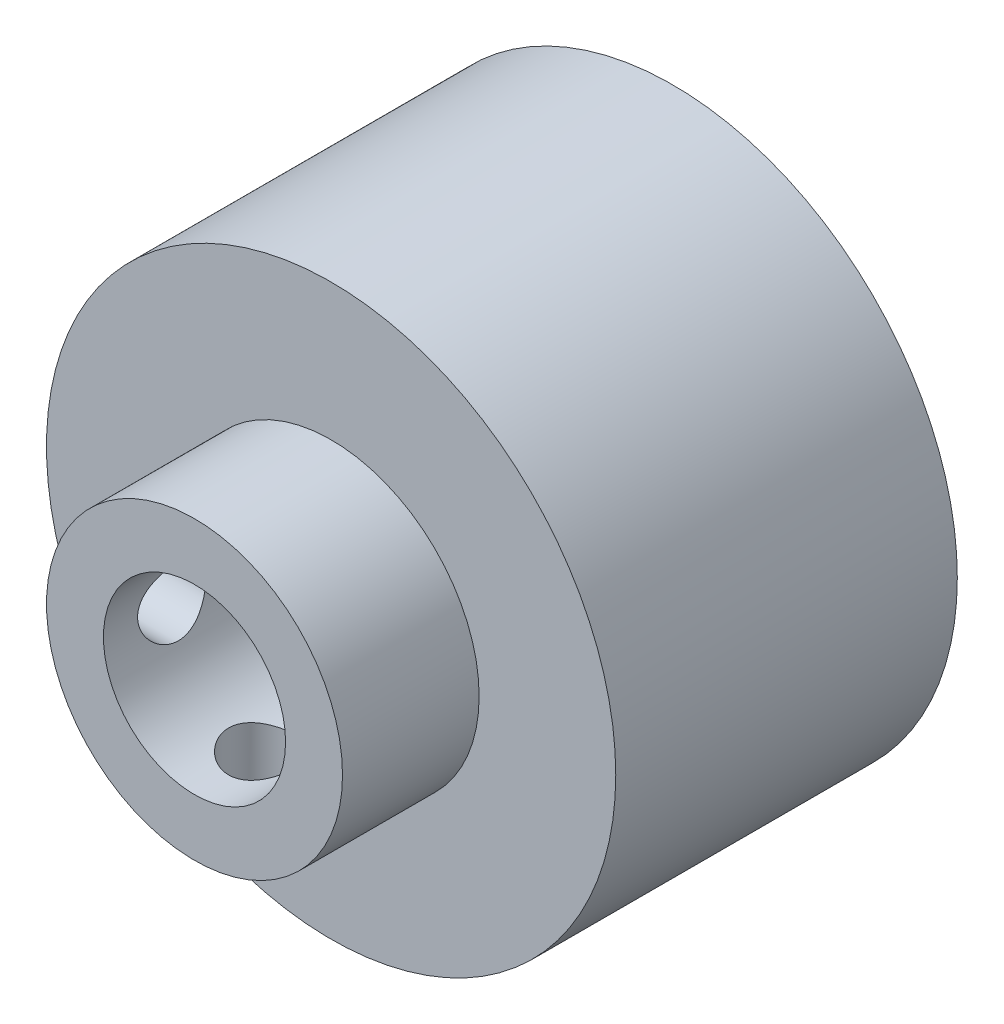
ISO-10303-21;
HEADER;
FILE_DESCRIPTION(('STEP AP214'),'2;1');
FILE_NAME('part.step','',(''),(''),'','','');
FILE_SCHEMA(('AUTOMOTIVE_DESIGN { 1 0 10303 214 1 1 1 1 }'));
ENDSEC;
DATA;
#1=APPLICATION_CONTEXT('core data for automotive mechanical design processes');
#2=APPLICATION_PROTOCOL_DEFINITION('international standard','automotive_design',2000,#1);
#3=PRODUCT_CONTEXT('',#1,'mechanical');
#4=PRODUCT('Part','Part','',(#3));
#5=PRODUCT_RELATED_PRODUCT_CATEGORY('part','',(#4));
#6=PRODUCT_DEFINITION_FORMATION('','',#4);
#7=PRODUCT_DEFINITION_CONTEXT('part definition',#1,'design');
#8=PRODUCT_DEFINITION('design','',#6,#7);
#9=PRODUCT_DEFINITION_SHAPE('','',#8);
#10=(LENGTH_UNIT() NAMED_UNIT(*) SI_UNIT(.MILLI.,.METRE.));
#11=(NAMED_UNIT(*) PLANE_ANGLE_UNIT() SI_UNIT($,.RADIAN.));
#12=(NAMED_UNIT(*) SI_UNIT($,.STERADIAN.) SOLID_ANGLE_UNIT());
#13=UNCERTAINTY_MEASURE_WITH_UNIT(LENGTH_MEASURE(1.E-05),#10,'distance_accuracy_value','');
#14=(GEOMETRIC_REPRESENTATION_CONTEXT(3) GLOBAL_UNCERTAINTY_ASSIGNED_CONTEXT((#13)) GLOBAL_UNIT_ASSIGNED_CONTEXT((#10,
#11,#12)) REPRESENTATION_CONTEXT('',''));
#15=CARTESIAN_POINT('',(0.,0.,0.));
#16=DIRECTION('',(0.,0.,1.));
#17=DIRECTION('',(1.,0.,0.));
#18=AXIS2_PLACEMENT_3D('',#15,#16,#17);
#19=CARTESIAN_POINT('',(0.,0.,15.));
#20=DIRECTION('',(0.,0.,-1.));
#21=DIRECTION('',(-1.,0.,0.));
#22=AXIS2_PLACEMENT_3D('',#19,#20,#21);
#23=CYLINDRICAL_SURFACE('',#22,12.5);
#24=CARTESIAN_POINT('',(0.,0.,15.));
#25=DIRECTION('',(0.,0.,1.));
#26=DIRECTION('',(1.,0.,0.));
#27=AXIS2_PLACEMENT_3D('',#24,#25,#26);
#28=CIRCLE('',#27,12.5);
#29=CARTESIAN_POINT('',(12.5,0.,15.));
#30=VERTEX_POINT('',#29);
#31=EDGE_CURVE('E49',#30,#30,#28,.T.);
#32=ORIENTED_EDGE('',*,*,#31,.F.);
#33=EDGE_LOOP('',(#32));
#34=FACE_BOUND('',#33,.T.);
#35=CARTESIAN_POINT('',(0.,0.,0.));
#36=DIRECTION('',(0.,0.,1.));
#37=DIRECTION('',(1.,0.,0.));
#38=AXIS2_PLACEMENT_3D('',#35,#36,#37);
#39=CIRCLE('',#38,12.5);
#40=CARTESIAN_POINT('',(12.5,0.,0.));
#41=VERTEX_POINT('',#40);
#42=EDGE_CURVE('E56',#41,#41,#39,.T.);
#43=ORIENTED_EDGE('',*,*,#42,.T.);
#44=EDGE_LOOP('',(#43));
#45=FACE_BOUND('',#44,.T.);
#46=ADVANCED_FACE('F36',(#34,#45),#23,.T.);
#47=CARTESIAN_POINT('',(0.,0.,15.));
#48=DIRECTION('',(0.,0.,1.));
#49=DIRECTION('',(1.,0.,0.));
#50=AXIS2_PLACEMENT_3D('',#47,#48,#49);
#51=PLANE('',#50);
#52=CARTESIAN_POINT('',(0.,0.,15.));
#53=DIRECTION('',(0.,0.,1.));
#54=DIRECTION('',(1.,0.,0.));
#55=AXIS2_PLACEMENT_3D('',#52,#53,#54);
#56=CIRCLE('',#55,6.5);
#57=CARTESIAN_POINT('',(6.5,0.,15.));
#58=VERTEX_POINT('',#57);
#59=EDGE_CURVE('E10',#58,#58,#56,.T.);
#60=ORIENTED_EDGE('',*,*,#59,.F.);
#61=EDGE_LOOP('',(#60));
#62=FACE_BOUND('',#61,.T.);
#63=ORIENTED_EDGE('',*,*,#31,.T.);
#64=EDGE_LOOP('',(#63));
#65=FACE_BOUND('',#64,.T.);
#66=ADVANCED_FACE('F104',(#62,#65),#51,.T.);
#67=CARTESIAN_POINT('',(0.,0.,0.));
#68=DIRECTION('',(0.,0.,1.));
#69=DIRECTION('',(1.,0.,0.));
#70=AXIS2_PLACEMENT_3D('',#67,#68,#69);
#71=PLANE('',#70);
#72=CARTESIAN_POINT('',(0.,0.,0.));
#73=DIRECTION('',(0.,0.,1.));
#74=DIRECTION('',(1.,0.,0.));
#75=AXIS2_PLACEMENT_3D('',#72,#73,#74);
#76=CIRCLE('',#75,4.);
#77=CARTESIAN_POINT('',(4.,0.,0.));
#78=VERTEX_POINT('',#77);
#79=EDGE_CURVE('E96',#78,#78,#76,.T.);
#80=ORIENTED_EDGE('',*,*,#79,.T.);
#81=EDGE_LOOP('',(#80));
#82=FACE_BOUND('',#81,.T.);
#83=ORIENTED_EDGE('',*,*,#42,.F.);
#84=EDGE_LOOP('',(#83));
#85=FACE_BOUND('',#84,.T.);
#86=ADVANCED_FACE('F102',(#82,#85),#71,.F.);
#87=CARTESIAN_POINT('',(0.,0.,21.));
#88=DIRECTION('',(0.,0.,-1.));
#89=DIRECTION('',(-1.,0.,0.));
#90=AXIS2_PLACEMENT_3D('',#87,#88,#89);
#91=CYLINDRICAL_SURFACE('',#90,6.5);
#92=CARTESIAN_POINT('',(-6.5,0.,19.5));
#93=CARTESIAN_POINT('',(-6.49999849532867,-0.0830761724763342,19.4999973346441));
#94=CARTESIAN_POINT('',(-6.49839124214547,-0.166183602986826,19.4930750731889));
#95=CARTESIAN_POINT('',(-6.49213500375529,-0.330029933246627,19.4656023571143));
#96=CARTESIAN_POINT('',(-6.48748401185166,-0.410767233683362,19.4450429115586));
#97=CARTESIAN_POINT('',(-6.47565710646771,-0.567482400649439,19.3909803010591));
#98=CARTESIAN_POINT('',(-6.46848397910972,-0.643465410431957,19.3574914148686));
#99=CARTESIAN_POINT('',(-6.45238316831829,-0.788732955280501,19.2785677349316));
#100=CARTESIAN_POINT('',(-6.44345549077589,-0.85801751283594,19.2331329812941));
#101=CARTESIAN_POINT('',(-6.42464323305021,-0.98915235312321,19.1307547483228));
#102=CARTESIAN_POINT('',(-6.41474568654138,-1.05086679216121,19.0736396382975));
#103=CARTESIAN_POINT('',(-6.39519859507266,-1.16393060397695,18.9498900734287));
#104=CARTESIAN_POINT('',(-6.38554907436474,-1.2152789664991,18.8832546918395));
#105=CARTESIAN_POINT('',(-6.36746174180576,-1.3067669575256,18.7413330724397));
#106=CARTESIAN_POINT('',(-6.35904049089481,-1.34675925477788,18.6659495590232));
#107=CARTESIAN_POINT('',(-6.34455046029963,-1.41345395330062,18.5093049013494));
#108=CARTESIAN_POINT('',(-6.33848136485541,-1.44015813854149,18.4280445477549));
#109=CARTESIAN_POINT('',(-6.32951534623235,-1.4790642425856,18.2634341984173));
#110=CARTESIAN_POINT('',(-6.32656557105072,-1.49150809496879,18.1801443266252));
#111=CARTESIAN_POINT('',(-6.32401364937952,-1.50229307046533,18.0126109129544));
#112=CARTESIAN_POINT('',(-6.32441104286173,-1.50063613156308,17.9283675037173));
#113=CARTESIAN_POINT('',(-6.32846083321139,-1.48346063285703,17.7631371921762));
#114=CARTESIAN_POINT('',(-6.33204661249555,-1.46822575315178,17.6821189186561));
#115=CARTESIAN_POINT('',(-6.34196351386388,-1.42477741479348,17.5238202080984));
#116=CARTESIAN_POINT('',(-6.34829480548987,-1.39656315462671,17.4465400022229));
#117=CARTESIAN_POINT('',(-6.36305332227188,-1.32770349075046,17.2971273283591));
#118=CARTESIAN_POINT('',(-6.37149843240945,-1.28695129246528,17.225045919089));
#119=CARTESIAN_POINT('',(-6.38952239681953,-1.19424748975256,17.0886407637106));
#120=CARTESIAN_POINT('',(-6.39910142196225,-1.14229419645531,17.024318189741));
#121=CARTESIAN_POINT('',(-6.41859777640793,-1.02717321086453,16.903626049949));
#122=CARTESIAN_POINT('',(-6.42851768847713,-0.963764950845055,16.847486114875));
#123=CARTESIAN_POINT('',(-6.44736816069401,-0.828318641053406,16.7465969290246));
#124=CARTESIAN_POINT('',(-6.45629869876005,-0.75628039874503,16.7018479324514));
#125=CARTESIAN_POINT('',(-6.47219854082994,-0.605321277972372,16.6249440858567));
#126=CARTESIAN_POINT('',(-6.47916273202417,-0.52638314329425,16.5928219843073));
#127=CARTESIAN_POINT('',(-6.49030757986402,-0.364032396252584,16.5423638563049));
#128=CARTESIAN_POINT('',(-6.49448868821629,-0.280620512374238,16.5240255926115));
#129=CARTESIAN_POINT('',(-6.49953102945198,-0.11365732393164,16.5019958496519));
#130=CARTESIAN_POINT('',(-6.50046326526885,-0.030149445012729,16.4979910639403));
#131=CARTESIAN_POINT('',(-6.49910299913129,0.136342371579224,16.5038890147593));
#132=CARTESIAN_POINT('',(-6.49681074208307,0.219326348562745,16.513790695068));
#133=CARTESIAN_POINT('',(-6.48930412349636,0.381357903798024,16.5469611966058));
#134=CARTESIAN_POINT('',(-6.48412623941868,0.460441464875701,16.5700632413171));
#135=CARTESIAN_POINT('',(-6.47142910428788,0.613609622481665,16.6287915889244));
#136=CARTESIAN_POINT('',(-6.4639096389422,0.687693760726587,16.6644190381358));
#137=CARTESIAN_POINT('',(-6.44718996088191,0.830037615110187,16.747822643921));
#138=CARTESIAN_POINT('',(-6.43796535296184,0.898188410296326,16.7957796918852));
#139=CARTESIAN_POINT('',(-6.41890391913982,1.02558718048179,16.9022456173586));
#140=CARTESIAN_POINT('',(-6.40906700421673,1.08483385664762,16.9607560315416));
#141=CARTESIAN_POINT('',(-6.38964047483402,1.19400102833017,17.088112385879));
#142=CARTESIAN_POINT('',(-6.3800601750374,1.24370343589042,17.1571469646774));
#143=CARTESIAN_POINT('',(-6.36246188496285,1.33081235446409,17.3027658802153));
#144=CARTESIAN_POINT('',(-6.35444382521927,1.3682194122462,17.3793498810384));
#145=CARTESIAN_POINT('',(-6.34095951164845,1.42941066868129,17.5374759884225));
#146=CARTESIAN_POINT('',(-6.33547846174878,1.45327404481083,17.6189861296834));
#147=CARTESIAN_POINT('',(-6.3276660054956,1.48692530676327,17.7850039928478));
#148=CARTESIAN_POINT('',(-6.32533402889437,1.49671574099563,17.86951116919));
#149=CARTESIAN_POINT('',(-6.32412253425542,1.50182536015786,18.0369182270526));
#150=CARTESIAN_POINT('',(-6.32516029248235,1.49749127871471,18.1198071106486));
#151=CARTESIAN_POINT('',(-6.33038270361014,1.47525685980881,18.2836386786682));
#152=CARTESIAN_POINT('',(-6.33456731037362,1.45735672124419,18.3645813916076));
#153=CARTESIAN_POINT('',(-6.34556939165105,1.40867420720143,18.5219099107911));
#154=CARTESIAN_POINT('',(-6.35237543592818,1.37794771033572,18.5983138607059));
#155=CARTESIAN_POINT('',(-6.36785683112448,1.304530822271,18.7449318065413));
#156=CARTESIAN_POINT('',(-6.37653240158127,1.26183902581514,18.8151450741274));
#157=CARTESIAN_POINT('',(-6.39501829374307,1.16457679516263,18.9490855285901));
#158=CARTESIAN_POINT('',(-6.4048496868242,1.10976162033287,19.0126321195496));
#159=CARTESIAN_POINT('',(-6.42440402438128,0.990297714593211,19.1297382476383));
#160=CARTESIAN_POINT('',(-6.43412694306169,0.925646696024379,19.1832954549303));
#161=CARTESIAN_POINT('',(-6.45253999299533,0.787191932761553,19.2796672679488));
#162=CARTESIAN_POINT('',(-6.46121270567525,0.713266869084887,19.3223111182898));
#163=CARTESIAN_POINT('',(-6.47637045552876,0.559109641475369,19.3944991494086));
#164=CARTESIAN_POINT('',(-6.48285722936411,0.478882547101935,19.4240537351029));
#165=CARTESIAN_POINT('',(-6.49182723396726,0.332210374198768,19.4642784735557));
#166=CARTESIAN_POINT('',(-6.49487228966801,0.266526367321009,19.477647271027));
#167=CARTESIAN_POINT('',(-6.4989592245111,0.133901630280836,19.4955088666147));
#168=CARTESIAN_POINT('',(-6.5000012127936,0.0669609687898308,19.5000021483273));
#169=CARTESIAN_POINT('',(-6.5,0.,19.5));
#170=B_SPLINE_CURVE_WITH_KNOTS('',3,(#92,#93,#94,#95,#96,#97,#98,#99,#100,#101,#102,#103,#104,
#105,#106,#107,#108,#109,#110,#111,#112,#113,#114,#115,#116,#117,#118,#119,#120,#121,#122,#123,
#124,#125,#126,#127,#128,#129,#130,#131,#132,#133,#134,#135,#136,#137,#138,#139,#140,#141,#142,
#143,#144,#145,#146,#147,#148,#149,#150,#151,#152,#153,#154,#155,#156,#157,#158,#159,#160,#161,
#162,#163,#164,#165,#166,#167,#168,#169),.UNSPECIFIED.,.T.,.F.,(4,2,2,2,2,2,2,2,2,2,2,2,2,2,2,2,
2,2,2,2,2,2,2,2,2,2,2,2,2,2,2,2,2,2,2,2,2,2,4),(0.,0.248983311217114,0.498130939431098,
0.747004202472747,0.995876629917202,1.24870930222222,1.50156660317464,1.75756840109411,
2.0135358206962,2.26509316141456,2.51661592915602,2.76300377758328,3.00940684320484,
3.25796969712265,3.50657005489342,3.7611752627951,4.01578615203542,4.27105309773002,
4.52627860236006,4.77589001432916,5.02548246887371,5.27198911757478,5.51851833225481,
5.76889433751052,6.01930682944867,6.27489540554877,6.53047261420161,6.7845398863154,
7.03856114466417,7.28639401438666,7.53422325058917,7.78098389306531,8.02777352833801,
8.28009323709707,8.53247172133002,8.78858609727297,9.04449651578221,9.24519271684376,
9.44587798236134),.UNSPECIFIED.);
#171=CARTESIAN_POINT('',(-6.5,0.,19.5));
#172=VERTEX_POINT('',#171);
#173=EDGE_CURVE('E72',#172,#172,#170,.T.);
#174=ORIENTED_EDGE('',*,*,#173,.T.);
#175=EDGE_LOOP('',(#174));
#176=FACE_BOUND('',#175,.T.);
#177=CARTESIAN_POINT('',(0.,-6.5,19.5));
#178=CARTESIAN_POINT('',(0.0830761724763341,-6.49999849532867,19.4999973346441));
#179=CARTESIAN_POINT('',(0.166183602986826,-6.49839124214547,19.4930750731889));
#180=CARTESIAN_POINT('',(0.330029933246627,-6.49213500375529,19.4656023571143));
#181=CARTESIAN_POINT('',(0.410767233683362,-6.48748401185166,19.4450429115586));
#182=CARTESIAN_POINT('',(0.567482400649438,-6.47565710646771,19.3909803010591));
#183=CARTESIAN_POINT('',(0.643465410431955,-6.46848397910972,19.3574914148687));
#184=CARTESIAN_POINT('',(0.788732955280499,-6.45238316831829,19.2785677349316));
#185=CARTESIAN_POINT('',(0.858017512835938,-6.44345549077589,19.2331329812941));
#186=CARTESIAN_POINT('',(0.989152353123208,-6.42464323305021,19.1307547483228));
#187=CARTESIAN_POINT('',(1.05086679216121,-6.41474568654138,19.0736396382975));
#188=CARTESIAN_POINT('',(1.16393060397695,-6.39519859507266,18.9498900734287));
#189=CARTESIAN_POINT('',(1.2152789664991,-6.38554907436474,18.8832546918395));
#190=CARTESIAN_POINT('',(1.3067669575256,-6.36746174180576,18.7413330724397));
#191=CARTESIAN_POINT('',(1.34675925477788,-6.35904049089481,18.6659495590232));
#192=CARTESIAN_POINT('',(1.41345395330062,-6.34455046029963,18.5093049013494));
#193=CARTESIAN_POINT('',(1.44015813854149,-6.33848136485541,18.4280445477549));
#194=CARTESIAN_POINT('',(1.4790642425856,-6.32951534623235,18.2634341984173));
#195=CARTESIAN_POINT('',(1.49150809496879,-6.32656557105072,18.1801443266252));
#196=CARTESIAN_POINT('',(1.50229307046533,-6.32401364937952,18.0126109129544));
#197=CARTESIAN_POINT('',(1.50063613156308,-6.32441104286173,17.9283675037173));
#198=CARTESIAN_POINT('',(1.48346063285703,-6.32846083321139,17.7631371921762));
#199=CARTESIAN_POINT('',(1.46822575315178,-6.33204661249555,17.6821189186561));
#200=CARTESIAN_POINT('',(1.42477741479348,-6.34196351386388,17.5238202080984));
#201=CARTESIAN_POINT('',(1.39656315462671,-6.34829480548987,17.4465400022229));
#202=CARTESIAN_POINT('',(1.32770349075046,-6.36305332227188,17.2971273283591));
#203=CARTESIAN_POINT('',(1.28695129246528,-6.37149843240945,17.225045919089));
#204=CARTESIAN_POINT('',(1.19424748975256,-6.38952239681953,17.0886407637106));
#205=CARTESIAN_POINT('',(1.14229419645531,-6.39910142196225,17.024318189741));
#206=CARTESIAN_POINT('',(1.02717321086453,-6.41859777640792,16.903626049949));
#207=CARTESIAN_POINT('',(0.963764950845056,-6.42851768847713,16.847486114875));
#208=CARTESIAN_POINT('',(0.828318641053408,-6.44736816069401,16.7465969290246));
#209=CARTESIAN_POINT('',(0.756280398745033,-6.45629869876004,16.7018479324514));
#210=CARTESIAN_POINT('',(0.605321277972374,-6.47219854082993,16.6249440858567));
#211=CARTESIAN_POINT('',(0.526383143294251,-6.47916273202417,16.5928219843073));
#212=CARTESIAN_POINT('',(0.364032396252585,-6.49030757986402,16.5423638563049));
#213=CARTESIAN_POINT('',(0.28062051237424,-6.49448868821629,16.5240255926115));
#214=CARTESIAN_POINT('',(0.113657323931642,-6.49953102945198,16.5019958496519));
#215=CARTESIAN_POINT('',(0.030149445012731,-6.50046326526885,16.4979910639403));
#216=CARTESIAN_POINT('',(-0.136342371579222,-6.49910299913129,16.5038890147593));
#217=CARTESIAN_POINT('',(-0.219326348562743,-6.49681074208307,16.513790695068));
#218=CARTESIAN_POINT('',(-0.381357903798022,-6.48930412349636,16.5469611966058));
#219=CARTESIAN_POINT('',(-0.460441464875699,-6.48412623941868,16.5700632413171));
#220=CARTESIAN_POINT('',(-0.613609622481664,-6.47142910428788,16.6287915889244));
#221=CARTESIAN_POINT('',(-0.687693760726586,-6.4639096389422,16.6644190381358));
#222=CARTESIAN_POINT('',(-0.830037615110185,-6.44718996088191,16.747822643921));
#223=CARTESIAN_POINT('',(-0.898188410296323,-6.43796535296184,16.7957796918852));
#224=CARTESIAN_POINT('',(-1.02558718048178,-6.41890391913982,16.9022456173586));
#225=CARTESIAN_POINT('',(-1.08483385664762,-6.40906700421673,16.9607560315416));
#226=CARTESIAN_POINT('',(-1.19400102833017,-6.38964047483402,17.088112385879));
#227=CARTESIAN_POINT('',(-1.24370343589042,-6.3800601750374,17.1571469646774));
#228=CARTESIAN_POINT('',(-1.33081235446409,-6.36246188496285,17.3027658802153));
#229=CARTESIAN_POINT('',(-1.3682194122462,-6.35444382521927,17.3793498810384));
#230=CARTESIAN_POINT('',(-1.42941066868129,-6.34095951164845,17.5374759884225));
#231=CARTESIAN_POINT('',(-1.45327404481082,-6.33547846174878,17.6189861296834));
#232=CARTESIAN_POINT('',(-1.48692530676327,-6.3276660054956,17.7850039928478));
#233=CARTESIAN_POINT('',(-1.49671574099563,-6.32533402889437,17.86951116919));
#234=CARTESIAN_POINT('',(-1.50182536015786,-6.32412253425542,18.0369182270526));
#235=CARTESIAN_POINT('',(-1.49749127871471,-6.32516029248235,18.1198071106486));
#236=CARTESIAN_POINT('',(-1.47525685980881,-6.33038270361014,18.2836386786682));
#237=CARTESIAN_POINT('',(-1.45735672124419,-6.33456731037362,18.3645813916076));
#238=CARTESIAN_POINT('',(-1.40867420720143,-6.34556939165105,18.5219099107911));
#239=CARTESIAN_POINT('',(-1.37794771033572,-6.35237543592818,18.5983138607059));
#240=CARTESIAN_POINT('',(-1.30453082227101,-6.36785683112448,18.7449318065413));
#241=CARTESIAN_POINT('',(-1.26183902581514,-6.37653240158127,18.8151450741273));
#242=CARTESIAN_POINT('',(-1.16457679516263,-6.39501829374307,18.9490855285901));
#243=CARTESIAN_POINT('',(-1.10976162033288,-6.4048496868242,19.0126321195496));
#244=CARTESIAN_POINT('',(-0.990297714593213,-6.42440402438128,19.1297382476383));
#245=CARTESIAN_POINT('',(-0.925646696024383,-6.43412694306169,19.1832954549303));
#246=CARTESIAN_POINT('',(-0.787191932761557,-6.45253999299533,19.2796672679488));
#247=CARTESIAN_POINT('',(-0.713266869084889,-6.46121270567525,19.3223111182898));
#248=CARTESIAN_POINT('',(-0.55910964147537,-6.47637045552876,19.3944991494086));
#249=CARTESIAN_POINT('',(-0.478882547101936,-6.48285722936411,19.4240537351029));
#250=CARTESIAN_POINT('',(-0.332210374198769,-6.49182723396726,19.4642784735557));
#251=CARTESIAN_POINT('',(-0.266526367321009,-6.49487228966801,19.477647271027));
#252=CARTESIAN_POINT('',(-0.133901630280836,-6.4989592245111,19.4955088666147));
#253=CARTESIAN_POINT('',(-0.0669609687898308,-6.5000012127936,19.5000021483273));
#254=CARTESIAN_POINT('',(0.,-6.5,19.5));
#255=B_SPLINE_CURVE_WITH_KNOTS('',3,(#177,#178,#179,#180,#181,#182,#183,#184,#185,#186,#187,
#188,#189,#190,#191,#192,#193,#194,#195,#196,#197,#198,#199,#200,#201,#202,#203,#204,#205,#206,
#207,#208,#209,#210,#211,#212,#213,#214,#215,#216,#217,#218,#219,#220,#221,#222,#223,#224,#225,
#226,#227,#228,#229,#230,#231,#232,#233,#234,#235,#236,#237,#238,#239,#240,#241,#242,#243,#244,
#245,#246,#247,#248,#249,#250,#251,#252,#253,#254),.UNSPECIFIED.,.T.,.F.,(4,2,2,2,2,2,2,2,2,2,2,
2,2,2,2,2,2,2,2,2,2,2,2,2,2,2,2,2,2,2,2,2,2,2,2,2,2,2,4),(0.,0.248983311217114,
0.498130939431098,0.747004202472744,0.995876629917199,1.24870930222222,1.50156660317464,
1.75756840109411,2.0135358206962,2.26509316141456,2.51661592915602,2.76300377758328,
3.00940684320484,3.25796969712265,3.50657005489342,3.7611752627951,4.01578615203542,
4.27105309773002,4.52627860236006,4.77589001432916,5.02548246887371,5.27198911757478,
5.51851833225481,5.76889433751052,6.01930682944867,6.27489540554877,6.53047261420161,
6.7845398863154,7.03856114466417,7.28639401438666,7.53422325058918,7.78098389306531,
8.02777352833801,8.28009323709707,8.53247172133002,8.78858609727297,9.04449651578221,
9.24519271684376,9.44587798236135),.UNSPECIFIED.);
#256=CARTESIAN_POINT('',(0.,-6.5,19.5));
#257=VERTEX_POINT('',#256);
#258=EDGE_CURVE('E71',#257,#257,#255,.T.);
#259=ORIENTED_EDGE('',*,*,#258,.T.);
#260=EDGE_LOOP('',(#259));
#261=FACE_BOUND('',#260,.T.);
#262=CARTESIAN_POINT('',(0.,0.,21.));
#263=DIRECTION('',(0.,0.,1.));
#264=DIRECTION('',(1.,0.,0.));
#265=AXIS2_PLACEMENT_3D('',#262,#263,#264);
#266=CIRCLE('',#265,6.5);
#267=CARTESIAN_POINT('',(6.5,0.,21.));
#268=VERTEX_POINT('',#267);
#269=EDGE_CURVE('E59',#268,#268,#266,.T.);
#270=ORIENTED_EDGE('',*,*,#269,.F.);
#271=EDGE_LOOP('',(#270));
#272=FACE_BOUND('',#271,.T.);
#273=ORIENTED_EDGE('',*,*,#59,.T.);
#274=EDGE_LOOP('',(#273));
#275=FACE_BOUND('',#274,.T.);
#276=ADVANCED_FACE('F97',(#176,#261,#272,#275),#91,.T.);
#277=CARTESIAN_POINT('',(0.,0.,21.));
#278=DIRECTION('',(0.,0.,1.));
#279=DIRECTION('',(1.,0.,0.));
#280=AXIS2_PLACEMENT_3D('',#277,#278,#279);
#281=PLANE('',#280);
#282=CARTESIAN_POINT('',(0.,0.,21.));
#283=DIRECTION('',(0.,0.,1.));
#284=DIRECTION('',(1.,0.,0.));
#285=AXIS2_PLACEMENT_3D('',#282,#283,#284);
#286=CIRCLE('',#285,4.);
#287=CARTESIAN_POINT('',(4.,0.,21.));
#288=VERTEX_POINT('',#287);
#289=EDGE_CURVE('E92',#288,#288,#286,.T.);
#290=ORIENTED_EDGE('',*,*,#289,.F.);
#291=EDGE_LOOP('',(#290));
#292=FACE_BOUND('',#291,.T.);
#293=ORIENTED_EDGE('',*,*,#269,.T.);
#294=EDGE_LOOP('',(#293));
#295=FACE_BOUND('',#294,.T.);
#296=ADVANCED_FACE('F101',(#292,#295),#281,.T.);
#297=CARTESIAN_POINT('',(0.,0.,0.));
#298=DIRECTION('',(0.,0.,1.));
#299=DIRECTION('',(1.,0.,0.));
#300=AXIS2_PLACEMENT_3D('',#297,#298,#299);
#301=CYLINDRICAL_SURFACE('',#300,4.);
#302=CARTESIAN_POINT('',(-4.,0.,16.5));
#303=CARTESIAN_POINT('',(-4.00000217456151,-0.0812350589378528,16.4999970976969));
#304=CARTESIAN_POINT('',(-3.99750379283184,-0.162450241781792,16.5066197602484));
#305=CARTESIAN_POINT('',(-3.98778696006928,-0.322453452352361,16.5328281952699));
#306=CARTESIAN_POINT('',(-3.98056918893993,-0.401241827987616,16.5524121004706));
#307=CARTESIAN_POINT('',(-3.96218832391545,-0.554060784990879,16.6037530017718));
#308=CARTESIAN_POINT('',(-3.9510328434944,-0.628100224162278,16.6354865168218));
#309=CARTESIAN_POINT('',(-3.92588767765353,-0.769799310160255,16.7101064130158));
#310=CARTESIAN_POINT('',(-3.91189723227548,-0.83745723917788,16.7529957855442));
#311=CARTESIAN_POINT('',(-3.88186246971217,-0.967346417045826,16.8506125310709));
#312=CARTESIAN_POINT('',(-3.86576002583566,-1.02927073015119,16.9057302622594));
#313=CARTESIAN_POINT('',(-3.83360220871327,-1.14324421474363,17.0254104346588));
#314=CARTESIAN_POINT('',(-3.81754685135033,-1.19529036359203,17.0899757560879));
#315=CARTESIAN_POINT('',(-3.78662470617731,-1.28998202215985,17.2297174675232));
#316=CARTESIAN_POINT('',(-3.77182648820818,-1.3321939319576,17.3052043665458));
#317=CARTESIAN_POINT('',(-3.74599860237433,-1.40318646334084,17.4628483541685));
#318=CARTESIAN_POINT('',(-3.73496742975881,-1.43197244961239,17.5450027631551));
#319=CARTESIAN_POINT('',(-3.71854412824136,-1.47408431017549,17.7101167402582));
#320=CARTESIAN_POINT('',(-3.71293924350838,-1.48799593218558,17.7929050384354));
#321=CARTESIAN_POINT('',(-3.70738061461215,-1.50179556531648,17.9598161579938));
#322=CARTESIAN_POINT('',(-3.70742453659305,-1.50168936802631,18.0439384138745));
#323=CARTESIAN_POINT('',(-3.71297511632055,-1.48790429610018,18.205769525213));
#324=CARTESIAN_POINT('',(-3.71815468871121,-1.47503808509003,18.2835609060442));
#325=CARTESIAN_POINT('',(-3.73284938059529,-1.4374416786833,18.4357871504053));
#326=CARTESIAN_POINT('',(-3.74236515298863,-1.41270969663258,18.5102215066139));
#327=CARTESIAN_POINT('',(-3.76485702190253,-1.35163748571904,18.6552770677282));
#328=CARTESIAN_POINT('',(-3.77789517988166,-1.31508648737101,18.7257994861213));
#329=CARTESIAN_POINT('',(-3.80594210139319,-1.23156073762698,18.859945737591));
#330=CARTESIAN_POINT('',(-3.82095154457158,-1.18458238728897,18.9235671775197));
#331=CARTESIAN_POINT('',(-3.85248038859113,-1.07781780766549,19.0466036636509));
#332=CARTESIAN_POINT('',(-3.86903347455671,-1.01738298716956,19.1054486407481));
#333=CARTESIAN_POINT('',(-3.90091728164085,-0.887312590819021,19.2123379662058));
#334=CARTESIAN_POINT('',(-3.91624781465952,-0.817675603497365,19.2603806546057));
#335=CARTESIAN_POINT('',(-3.9442639480908,-0.66972343699242,19.3449303970625));
#336=CARTESIAN_POINT('',(-3.95690498259616,-0.591290713844719,19.3812475812211));
#337=CARTESIAN_POINT('',(-3.97778718326962,-0.428836850524583,19.43998260427));
#338=CARTESIAN_POINT('',(-3.98603030341493,-0.344818210845767,19.4624066165611));
#339=CARTESIAN_POINT('',(-3.99684443228065,-0.178375243148666,19.4916227875419));
#340=CARTESIAN_POINT('',(-3.99969369025686,-0.0961036195622096,19.4991826063825));
#341=CARTESIAN_POINT('',(-4.00025893700126,0.0685724752550242,19.5006910638999));
#342=CARTESIAN_POINT('',(-3.99797606386863,0.150976912983373,19.4946427203168));
#343=CARTESIAN_POINT('',(-3.98871709772643,0.310262048561859,19.4696899576913));
#344=CARTESIAN_POINT('',(-3.98192470962305,0.387233328007336,19.4512884562629));
#345=CARTESIAN_POINT('',(-3.96451477091717,0.536941754957221,19.4028139274527));
#346=CARTESIAN_POINT('',(-3.9538967228203,0.609678350347534,19.372739382052));
#347=CARTESIAN_POINT('',(-3.92949624407681,0.751247765110155,19.3008135875605));
#348=CARTESIAN_POINT('',(-3.91563000209348,0.819903083557796,19.2586422707766));
#349=CARTESIAN_POINT('',(-3.88626671564664,0.949392711726626,19.1640818968284));
#350=CARTESIAN_POINT('',(-3.87076907009516,1.01022412027045,19.1116890674548));
#351=CARTESIAN_POINT('',(-3.83873329490989,1.12603079874454,18.9945958778757));
#352=CARTESIAN_POINT('',(-3.82218696503729,1.18046154123568,18.9293578172273));
#353=CARTESIAN_POINT('',(-3.79078815746854,1.27771050031903,18.7903486152923));
#354=CARTESIAN_POINT('',(-3.77593583194399,1.32052767414519,18.7165767086115));
#355=CARTESIAN_POINT('',(-3.74966829822463,1.39337773518998,18.5619840132277));
#356=CARTESIAN_POINT('',(-3.73826760328493,1.42335685446918,18.4811352540896));
#357=CARTESIAN_POINT('',(-3.72054032891005,1.46907883466889,18.3149902363122));
#358=CARTESIAN_POINT('',(-3.71421061057491,1.48483050305535,18.2296967638019));
#359=CARTESIAN_POINT('',(-3.70775894792573,1.50086347097839,18.0629838404589));
#360=CARTESIAN_POINT('',(-3.70726444523341,1.50207331495837,17.9816673682831));
#361=CARTESIAN_POINT('',(-3.71158412745292,1.49136715641593,17.8200546837238));
#362=CARTESIAN_POINT('',(-3.71639780898899,1.47945239850124,17.7397583753284));
#363=CARTESIAN_POINT('',(-3.73048141585432,1.44355815630242,17.5849527732834));
#364=CARTESIAN_POINT('',(-3.73961085376663,1.41995798316524,17.5103416537547));
#365=CARTESIAN_POINT('',(-3.76121548297845,1.3616969677992,17.3660944915056));
#366=CARTESIAN_POINT('',(-3.77369151995215,1.32703332944945,17.2964597119299));
#367=CARTESIAN_POINT('',(-3.80139723903965,1.24552075938154,17.1601732103024));
#368=CARTESIAN_POINT('',(-3.81673698440964,1.1981283280301,17.0938692032001));
#369=CARTESIAN_POINT('',(-3.84806246757177,1.09334485729906,16.9698584390288));
#370=CARTESIAN_POINT('',(-3.86404840943145,1.03595064012808,16.9121544252132));
#371=CARTESIAN_POINT('',(-3.89590424609881,0.909080396784623,16.8037980441782));
#372=CARTESIAN_POINT('',(-3.91172104900645,0.839118644212993,16.7536962465653));
#373=CARTESIAN_POINT('',(-3.94054514457031,0.691213223200822,16.6659773447234));
#374=CARTESIAN_POINT('',(-3.95355221851559,0.613268934090622,16.6283612122636));
#375=CARTESIAN_POINT('',(-3.9757429260668,0.447999082002312,16.5656231709517));
#376=CARTESIAN_POINT('',(-3.98473657158356,0.360413422234208,16.5411129353981));
#377=CARTESIAN_POINT('',(-3.99686242179587,0.181875733606382,16.5083070400793));
#378=CARTESIAN_POINT('',(-3.99999756603967,0.0909254163648587,16.5000032485127));
#379=CARTESIAN_POINT('',(-4.,0.,16.5));
#380=B_SPLINE_CURVE_WITH_KNOTS('',3,(#302,#303,#304,#305,#306,#307,#308,#309,#310,#311,#312,
#313,#314,#315,#316,#317,#318,#319,#320,#321,#322,#323,#324,#325,#326,#327,#328,#329,#330,#331,
#332,#333,#334,#335,#336,#337,#338,#339,#340,#341,#342,#343,#344,#345,#346,#347,#348,#349,#350,
#351,#352,#353,#354,#355,#356,#357,#358,#359,#360,#361,#362,#363,#364,#365,#366,#367,#368,#369,
#370,#371,#372,#373,#374,#375,#376,#377,#378,#379),.UNSPECIFIED.,.T.,.F.,(4,2,2,2,2,2,2,2,2,2,2,
2,2,2,2,2,2,2,2,2,2,2,2,2,2,2,2,2,2,2,2,2,2,2,2,2,2,2,4),(0.,0.24336980156056,0.48670454953046,
0.729571369213573,0.972503379609492,1.22473618582716,1.47704604925622,1.73896674501658,
2.00078269352134,2.25185874416901,2.50283106079707,2.73878345119972,2.97477138060589,
3.21522408387018,3.45575990744259,3.71246153335813,3.96920257905066,4.22991375286075,
4.49050899698846,4.73725019635926,4.98393668390521,5.2211443792384,5.45838293254454,
5.702592218596,5.94689180019868,6.20536519455658,6.46386178920141,6.72343066727204,
6.98283874956507,7.22558763480252,7.4683135021126,7.70363142426534,7.93900886656507,
8.18672471884271,8.43451941997062,8.69572329654039,8.95694749805102,9.22948515032043,
9.50188601796128),.UNSPECIFIED.);
#381=CARTESIAN_POINT('',(-4.,0.,16.5));
#382=VERTEX_POINT('',#381);
#383=EDGE_CURVE('E39',#382,#382,#380,.T.);
#384=ORIENTED_EDGE('',*,*,#383,.T.);
#385=EDGE_LOOP('',(#384));
#386=FACE_BOUND('',#385,.T.);
#387=CARTESIAN_POINT('',(0.,-4.,19.5));
#388=CARTESIAN_POINT('',(-0.0812350589378528,-4.00000217456151,19.5000029023031));
#389=CARTESIAN_POINT('',(-0.162450241781792,-3.99750379283184,19.4933802397516));
#390=CARTESIAN_POINT('',(-0.322453452352361,-3.98778696006928,19.4671718047301));
#391=CARTESIAN_POINT('',(-0.401241827987616,-3.98056918893993,19.4475878995294));
#392=CARTESIAN_POINT('',(-0.554060784990878,-3.96218832391545,19.3962469982282));
#393=CARTESIAN_POINT('',(-0.628100224162277,-3.9510328434944,19.3645134831782));
#394=CARTESIAN_POINT('',(-0.769799310160253,-3.92588767765353,19.2898935869842));
#395=CARTESIAN_POINT('',(-0.837457239177879,-3.91189723227548,19.2470042144558));
#396=CARTESIAN_POINT('',(-0.967346417045826,-3.88186246971217,19.1493874689291));
#397=CARTESIAN_POINT('',(-1.02927073015119,-3.86576002583566,19.0942697377406));
#398=CARTESIAN_POINT('',(-1.14324421474363,-3.83360220871327,18.9745895653412));
#399=CARTESIAN_POINT('',(-1.19529036359203,-3.81754685135033,18.9100242439121));
#400=CARTESIAN_POINT('',(-1.28998202215985,-3.78662470617731,18.7702825324768));
#401=CARTESIAN_POINT('',(-1.3321939319576,-3.77182648820818,18.6947956334542));
#402=CARTESIAN_POINT('',(-1.40318646334084,-3.74599860237433,18.5371516458315));
#403=CARTESIAN_POINT('',(-1.43197244961239,-3.73496742975881,18.4549972368449));
#404=CARTESIAN_POINT('',(-1.47408431017549,-3.71854412824136,18.2898832597418));
#405=CARTESIAN_POINT('',(-1.48799593218558,-3.71293924350838,18.2070949615646));
#406=CARTESIAN_POINT('',(-1.50179556531648,-3.70738061461215,18.0401838420062));
#407=CARTESIAN_POINT('',(-1.50168936802631,-3.70742453659305,17.9560615861255));
#408=CARTESIAN_POINT('',(-1.48790429610018,-3.71297511632055,17.794230474787));
#409=CARTESIAN_POINT('',(-1.47503808509004,-3.71815468871121,17.7164390939558));
#410=CARTESIAN_POINT('',(-1.4374416786833,-3.73284938059529,17.5642128495947));
#411=CARTESIAN_POINT('',(-1.41270969663258,-3.74236515298863,17.4897784933861));
#412=CARTESIAN_POINT('',(-1.35163748571904,-3.76485702190253,17.3447229322718));
#413=CARTESIAN_POINT('',(-1.31508648737101,-3.77789517988166,17.2742005138787));
#414=CARTESIAN_POINT('',(-1.23156073762698,-3.80594210139319,17.140054262409));
#415=CARTESIAN_POINT('',(-1.18458238728897,-3.82095154457158,17.0764328224803));
#416=CARTESIAN_POINT('',(-1.07781780766549,-3.85248038859113,16.9533963363491));
#417=CARTESIAN_POINT('',(-1.01738298716956,-3.86903347455671,16.8945513592519));
#418=CARTESIAN_POINT('',(-0.887312590819022,-3.90091728164085,16.7876620337942));
#419=CARTESIAN_POINT('',(-0.817675603497365,-3.91624781465952,16.7396193453943));
#420=CARTESIAN_POINT('',(-0.66972343699242,-3.9442639480908,16.6550696029375));
#421=CARTESIAN_POINT('',(-0.59129071384472,-3.95690498259616,16.6187524187789));
#422=CARTESIAN_POINT('',(-0.428836850524583,-3.97778718326962,16.56001739573));
#423=CARTESIAN_POINT('',(-0.344818210845767,-3.98603030341493,16.5375933834389));
#424=CARTESIAN_POINT('',(-0.178375243148665,-3.99684443228065,16.5083772124581));
#425=CARTESIAN_POINT('',(-0.0961036195622089,-3.99969369025686,16.5008173936175));
#426=CARTESIAN_POINT('',(0.0685724752550242,-4.00025893700126,16.4993089361001));
#427=CARTESIAN_POINT('',(0.150976912983372,-3.99797606386863,16.5053572796832));
#428=CARTESIAN_POINT('',(0.310262048561859,-3.98871709772643,16.5303100423087));
#429=CARTESIAN_POINT('',(0.387233328007335,-3.98192470962305,16.5487115437371));
#430=CARTESIAN_POINT('',(0.53694175495722,-3.96451477091717,16.5971860725473));
#431=CARTESIAN_POINT('',(0.609678350347534,-3.9538967228203,16.627260617948));
#432=CARTESIAN_POINT('',(0.751247765110155,-3.92949624407681,16.6991864124395));
#433=CARTESIAN_POINT('',(0.819903083557795,-3.91563000209348,16.7413577292234));
#434=CARTESIAN_POINT('',(0.949392711726626,-3.88626671564664,16.8359181031716));
#435=CARTESIAN_POINT('',(1.01022412027045,-3.87076907009516,16.8883109325452));
#436=CARTESIAN_POINT('',(1.12603079874454,-3.83873329490989,17.0054041221243));
#437=CARTESIAN_POINT('',(1.18046154123569,-3.82218696503729,17.0706421827727));
#438=CARTESIAN_POINT('',(1.27771050031903,-3.79078815746854,17.2096513847077));
#439=CARTESIAN_POINT('',(1.32052767414519,-3.77593583194399,17.2834232913885));
#440=CARTESIAN_POINT('',(1.39337773518998,-3.74966829822463,17.4380159867723));
#441=CARTESIAN_POINT('',(1.42335685446918,-3.73826760328493,17.5188647459104));
#442=CARTESIAN_POINT('',(1.46907883466889,-3.72054032891005,17.6850097636878));
#443=CARTESIAN_POINT('',(1.48483050305535,-3.71421061057491,17.7703032361981));
#444=CARTESIAN_POINT('',(1.50086347097839,-3.70775894792573,17.9370161595411));
#445=CARTESIAN_POINT('',(1.50207331495837,-3.70726444523341,18.0183326317169));
#446=CARTESIAN_POINT('',(1.49136715641593,-3.71158412745292,18.1799453162762));
#447=CARTESIAN_POINT('',(1.47945239850124,-3.71639780898899,18.2602416246716));
#448=CARTESIAN_POINT('',(1.44355815630242,-3.73048141585432,18.4150472267166));
#449=CARTESIAN_POINT('',(1.41995798316524,-3.73961085376663,18.4896583462453));
#450=CARTESIAN_POINT('',(1.3616969677992,-3.76121548297845,18.6339055084944));
#451=CARTESIAN_POINT('',(1.32703332944945,-3.77369151995215,18.7035402880701));
#452=CARTESIAN_POINT('',(1.24552075938154,-3.80139723903964,18.8398267896976));
#453=CARTESIAN_POINT('',(1.1981283280301,-3.81673698440964,18.9061307967999));
#454=CARTESIAN_POINT('',(1.09334485729906,-3.84806246757177,19.0301415609712));
#455=CARTESIAN_POINT('',(1.03595064012808,-3.86404840943145,19.0878455747868));
#456=CARTESIAN_POINT('',(0.909080396784623,-3.89590424609881,19.1962019558218));
#457=CARTESIAN_POINT('',(0.839118644212991,-3.91172104900645,19.2463037534347));
#458=CARTESIAN_POINT('',(0.69121322320082,-3.94054514457031,19.3340226552766));
#459=CARTESIAN_POINT('',(0.613268934090622,-3.95355221851559,19.3716387877364));
#460=CARTESIAN_POINT('',(0.447999082002314,-3.9757429260668,19.4343768290483));
#461=CARTESIAN_POINT('',(0.360413422234211,-3.98473657158356,19.4588870646019));
#462=CARTESIAN_POINT('',(0.181875733606384,-3.99686242179587,19.4916929599207));
#463=CARTESIAN_POINT('',(0.0909254163648598,-3.99999756603967,19.4999967514873));
#464=CARTESIAN_POINT('',(0.,-4.,19.5));
#465=B_SPLINE_CURVE_WITH_KNOTS('',3,(#387,#388,#389,#390,#391,#392,#393,#394,#395,#396,#397,
#398,#399,#400,#401,#402,#403,#404,#405,#406,#407,#408,#409,#410,#411,#412,#413,#414,#415,#416,
#417,#418,#419,#420,#421,#422,#423,#424,#425,#426,#427,#428,#429,#430,#431,#432,#433,#434,#435,
#436,#437,#438,#439,#440,#441,#442,#443,#444,#445,#446,#447,#448,#449,#450,#451,#452,#453,#454,
#455,#456,#457,#458,#459,#460,#461,#462,#463,#464),.UNSPECIFIED.,.T.,.F.,(4,2,2,2,2,2,2,2,2,2,2,
2,2,2,2,2,2,2,2,2,2,2,2,2,2,2,2,2,2,2,2,2,2,2,2,2,2,2,4),(0.,0.24336980156056,0.48670454953046,
0.729571369213572,0.972503379609489,1.22473618582715,1.47704604925622,1.73896674501658,
2.00078269352134,2.25185874416901,2.50283106079707,2.73878345119971,2.97477138060589,
3.21522408387018,3.45575990744259,3.71246153335813,3.96920257905066,4.22991375286075,
4.49050899698846,4.73725019635926,4.98393668390521,5.2211443792384,5.45838293254454,
5.702592218596,5.94689180019868,6.20536519455659,6.46386178920141,6.72343066727205,
6.98283874956507,7.22558763480252,7.46831350211259,7.70363142426534,7.93900886656507,
8.18672471884272,8.43451941997063,8.6957232965404,8.95694749805102,9.22948515032042,
9.50188601796128),.UNSPECIFIED.);
#466=CARTESIAN_POINT('',(0.,-4.,19.5));
#467=VERTEX_POINT('',#466);
#468=EDGE_CURVE('E64',#467,#467,#465,.T.);
#469=ORIENTED_EDGE('',*,*,#468,.T.);
#470=EDGE_LOOP('',(#469));
#471=FACE_BOUND('',#470,.T.);
#472=ORIENTED_EDGE('',*,*,#79,.F.);
#473=EDGE_LOOP('',(#472));
#474=FACE_BOUND('',#473,.T.);
#475=ORIENTED_EDGE('',*,*,#289,.T.);
#476=EDGE_LOOP('',(#475));
#477=FACE_BOUND('',#476,.T.);
#478=ADVANCED_FACE('F73',(#386,#471,#474,#477),#301,.F.);
#479=CARTESIAN_POINT('',(0.,-12.5,18.));
#480=DIRECTION('',(0.,1.,0.));
#481=DIRECTION('',(0.,0.,1.));
#482=AXIS2_PLACEMENT_3D('',#479,#480,#481);
#483=CYLINDRICAL_SURFACE('',#482,1.5);
#484=ORIENTED_EDGE('',*,*,#468,.F.);
#485=EDGE_LOOP('',(#484));
#486=FACE_BOUND('',#485,.T.);
#487=ORIENTED_EDGE('',*,*,#258,.F.);
#488=EDGE_LOOP('',(#487));
#489=FACE_BOUND('',#488,.T.);
#490=ADVANCED_FACE('F76',(#486,#489),#483,.F.);
#491=CARTESIAN_POINT('',(-12.5,0.,18.));
#492=DIRECTION('',(1.,0.,0.));
#493=DIRECTION('',(0.,0.,-1.));
#494=AXIS2_PLACEMENT_3D('',#491,#492,#493);
#495=CYLINDRICAL_SURFACE('',#494,1.5);
#496=ORIENTED_EDGE('',*,*,#383,.F.);
#497=EDGE_LOOP('',(#496));
#498=FACE_BOUND('',#497,.T.);
#499=ORIENTED_EDGE('',*,*,#173,.F.);
#500=EDGE_LOOP('',(#499));
#501=FACE_BOUND('',#500,.T.);
#502=ADVANCED_FACE('F79',(#498,#501),#495,.F.);
#503=CLOSED_SHELL('',(#46,#66,#86,#276,#296,#478,#490,#502));
#504=MANIFOLD_SOLID_BREP('B2',#503);
#505=ADVANCED_BREP_SHAPE_REPRESENTATION('',(#18,#504),#14);
#506=SHAPE_DEFINITION_REPRESENTATION(#9,#505);
ENDSEC;
END-ISO-10303-21;
